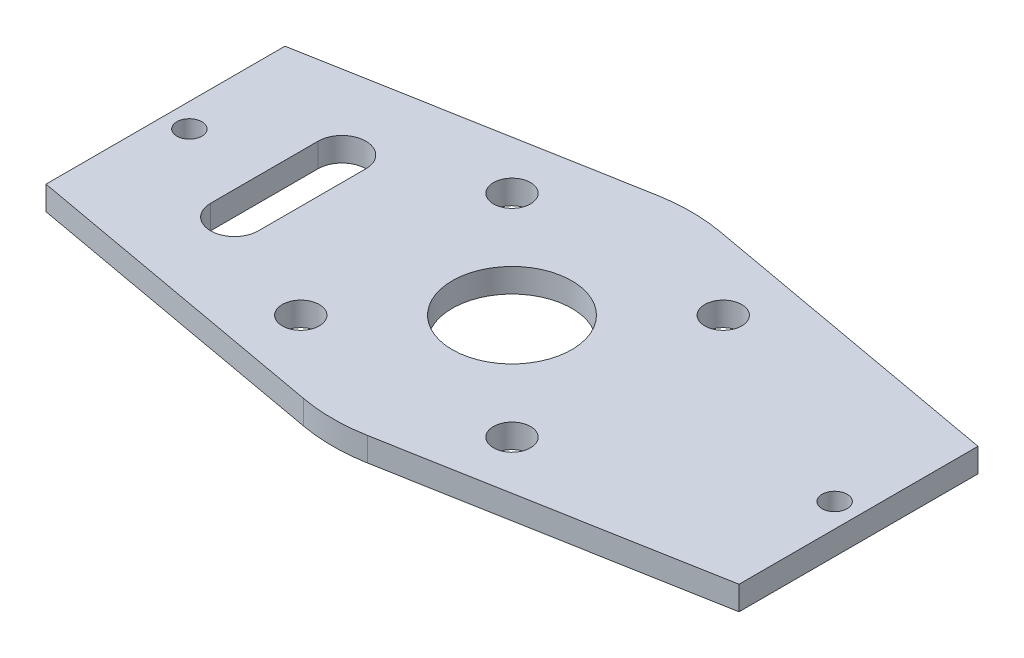
ISO-10303-21;
HEADER;
FILE_DESCRIPTION(('STEP AP214'),'2;1');
FILE_NAME('part.step','',(''),(''),'','','');
FILE_SCHEMA(('AUTOMOTIVE_DESIGN { 1 0 10303 214 1 1 1 1 }'));
ENDSEC;
DATA;
#1=APPLICATION_CONTEXT('core data for automotive mechanical design processes');
#2=APPLICATION_PROTOCOL_DEFINITION('international standard','automotive_design',2000,#1);
#3=PRODUCT_CONTEXT('',#1,'mechanical');
#4=PRODUCT('Part','Part','',(#3));
#5=PRODUCT_RELATED_PRODUCT_CATEGORY('part','',(#4));
#6=PRODUCT_DEFINITION_FORMATION('','',#4);
#7=PRODUCT_DEFINITION_CONTEXT('part definition',#1,'design');
#8=PRODUCT_DEFINITION('design','',#6,#7);
#9=PRODUCT_DEFINITION_SHAPE('','',#8);
#10=(LENGTH_UNIT() NAMED_UNIT(*) SI_UNIT(.MILLI.,.METRE.));
#11=(NAMED_UNIT(*) PLANE_ANGLE_UNIT() SI_UNIT($,.RADIAN.));
#12=(NAMED_UNIT(*) SI_UNIT($,.STERADIAN.) SOLID_ANGLE_UNIT());
#13=UNCERTAINTY_MEASURE_WITH_UNIT(LENGTH_MEASURE(1.E-05),#10,'distance_accuracy_value','');
#14=(GEOMETRIC_REPRESENTATION_CONTEXT(3) GLOBAL_UNCERTAINTY_ASSIGNED_CONTEXT((#13)) GLOBAL_UNIT_ASSIGNED_CONTEXT((#10,
#11,#12)) REPRESENTATION_CONTEXT('',''));
#15=CARTESIAN_POINT('',(0.,0.,0.));
#16=DIRECTION('',(0.,0.,1.));
#17=DIRECTION('',(1.,0.,0.));
#18=AXIS2_PLACEMENT_3D('',#15,#16,#17);
#19=CARTESIAN_POINT('',(0.,2.,0.));
#20=DIRECTION('',(0.,-1.,0.));
#21=DIRECTION('',(0.,0.,-1.));
#22=AXIS2_PLACEMENT_3D('',#19,#20,#21);
#23=PLANE('',#22);
#24=CARTESIAN_POINT('',(-27.,2.,0.));
#25=DIRECTION('',(0.,1.,0.));
#26=DIRECTION('',(0.,0.,1.));
#27=AXIS2_PLACEMENT_3D('',#24,#25,#26);
#28=CIRCLE('',#27,1.05);
#29=CARTESIAN_POINT('',(-27.,2.,1.05));
#30=VERTEX_POINT('',#29);
#31=EDGE_CURVE('E163',#30,#30,#28,.T.);
#32=ORIENTED_EDGE('',*,*,#31,.F.);
#33=EDGE_LOOP('',(#32));
#34=FACE_BOUND('',#33,.T.);
#35=CARTESIAN_POINT('',(27.,2.,0.));
#36=DIRECTION('',(0.,1.,0.));
#37=DIRECTION('',(0.,0.,1.));
#38=AXIS2_PLACEMENT_3D('',#35,#36,#37);
#39=CIRCLE('',#38,1.05);
#40=CARTESIAN_POINT('',(27.,2.,1.05));
#41=VERTEX_POINT('',#40);
#42=EDGE_CURVE('E169',#41,#41,#39,.T.);
#43=ORIENTED_EDGE('',*,*,#42,.F.);
#44=EDGE_LOOP('',(#43));
#45=FACE_BOUND('',#44,.T.);
#46=CARTESIAN_POINT('',(8.83883476483235,2.,8.83883476483183));
#47=DIRECTION('',(0.,1.,0.));
#48=DIRECTION('',(0.,0.,1.));
#49=AXIS2_PLACEMENT_3D('',#46,#47,#48);
#50=CIRCLE('',#49,1.54999999999988);
#51=CARTESIAN_POINT('',(8.83883476483235,2.,10.3888347648317));
#52=VERTEX_POINT('',#51);
#53=EDGE_CURVE('E175',#52,#52,#50,.T.);
#54=ORIENTED_EDGE('',*,*,#53,.F.);
#55=EDGE_LOOP('',(#54));
#56=FACE_BOUND('',#55,.T.);
#57=CARTESIAN_POINT('',(8.83883476483183,2.,-8.83883476483186));
#58=DIRECTION('',(0.,1.,0.));
#59=DIRECTION('',(0.,0.,1.));
#60=AXIS2_PLACEMENT_3D('',#57,#58,#59);
#61=CIRCLE('',#60,1.55);
#62=CARTESIAN_POINT('',(8.83883476483183,2.,-7.28883476483186));
#63=VERTEX_POINT('',#62);
#64=EDGE_CURVE('E181',#63,#63,#61,.T.);
#65=ORIENTED_EDGE('',*,*,#64,.F.);
#66=EDGE_LOOP('',(#65));
#67=FACE_BOUND('',#66,.T.);
#68=CARTESIAN_POINT('',(0.,2.,0.));
#69=DIRECTION('',(0.,1.,0.));
#70=DIRECTION('',(0.,0.,1.));
#71=AXIS2_PLACEMENT_3D('',#68,#69,#70);
#72=CIRCLE('',#71,5.);
#73=CARTESIAN_POINT('',(0.,2.,5.));
#74=VERTEX_POINT('',#73);
#75=EDGE_CURVE('E187',#74,#74,#72,.T.);
#76=ORIENTED_EDGE('',*,*,#75,.F.);
#77=EDGE_LOOP('',(#76));
#78=FACE_BOUND('',#77,.T.);
#79=CARTESIAN_POINT('',(0.,2.,0.));
#80=DIRECTION('',(0.,1.,0.));
#81=DIRECTION('',(0.,0.,-1.));
#82=AXIS2_PLACEMENT_3D('',#79,#80,#81);
#83=CIRCLE('',#82,15.);
#84=CARTESIAN_POINT('',(2.66872853551764,2.,-14.7606872469988));
#85=VERTEX_POINT('',#84);
#86=CARTESIAN_POINT('',(-2.66872853551764,2.,-14.7606872469988));
#87=VERTEX_POINT('',#86);
#88=EDGE_CURVE('E193',#85,#87,#83,.T.);
#89=ORIENTED_EDGE('',*,*,#88,.T.);
#90=DIRECTION('',(-0.984045816466589,0.,0.177915235701176));
#91=VECTOR('',#90,1.);
#92=CARTESIAN_POINT('',(-2.66872853551764,2.,-14.7606872469988));
#93=LINE('',#92,#91);
#94=CARTESIAN_POINT('',(-29.,2.,-10.));
#95=VERTEX_POINT('',#94);
#96=EDGE_CURVE('E196',#87,#95,#93,.T.);
#97=ORIENTED_EDGE('',*,*,#96,.T.);
#98=DIRECTION('',(0.,0.,1.));
#99=VECTOR('',#98,1.);
#100=CARTESIAN_POINT('',(-29.,2.,-10.));
#101=LINE('',#100,#99);
#102=CARTESIAN_POINT('',(-29.,2.,9.99999999999999));
#103=VERTEX_POINT('',#102);
#104=EDGE_CURVE('E199',#95,#103,#101,.T.);
#105=ORIENTED_EDGE('',*,*,#104,.T.);
#106=DIRECTION('',(0.984045816466589,0.,0.177915235701176));
#107=VECTOR('',#106,1.);
#108=CARTESIAN_POINT('',(-2.66872853551765,2.,14.7606872469988));
#109=LINE('',#108,#107);
#110=CARTESIAN_POINT('',(-2.66872853551764,2.,14.7606872469988));
#111=VERTEX_POINT('',#110);
#112=EDGE_CURVE('E201',#103,#111,#109,.T.);
#113=ORIENTED_EDGE('',*,*,#112,.T.);
#114=CARTESIAN_POINT('',(0.,2.,0.));
#115=DIRECTION('',(0.,1.,0.));
#116=DIRECTION('',(0.,0.,-1.));
#117=AXIS2_PLACEMENT_3D('',#114,#115,#116);
#118=CIRCLE('',#117,15.);
#119=CARTESIAN_POINT('',(2.66872853551765,2.,14.7606872469988));
#120=VERTEX_POINT('',#119);
#121=EDGE_CURVE('E203',#111,#120,#118,.T.);
#122=ORIENTED_EDGE('',*,*,#121,.T.);
#123=DIRECTION('',(0.984045816466589,0.,-0.177915235701177));
#124=VECTOR('',#123,1.);
#125=CARTESIAN_POINT('',(2.66872853551765,2.,14.7606872469988));
#126=LINE('',#125,#124);
#127=CARTESIAN_POINT('',(29.,2.,9.99999999999999));
#128=VERTEX_POINT('',#127);
#129=EDGE_CURVE('E205',#120,#128,#126,.T.);
#130=ORIENTED_EDGE('',*,*,#129,.T.);
#131=DIRECTION('',(0.,0.,-1.));
#132=VECTOR('',#131,1.);
#133=CARTESIAN_POINT('',(29.,2.,-10.));
#134=LINE('',#133,#132);
#135=CARTESIAN_POINT('',(29.,2.,-10.));
#136=VERTEX_POINT('',#135);
#137=EDGE_CURVE('E207',#128,#136,#134,.T.);
#138=ORIENTED_EDGE('',*,*,#137,.T.);
#139=DIRECTION('',(-0.984045816466589,0.,-0.177915235701176));
#140=VECTOR('',#139,1.);
#141=CARTESIAN_POINT('',(2.66872853551764,2.,-14.7606872469988));
#142=LINE('',#141,#140);
#143=EDGE_CURVE('E209',#136,#85,#142,.T.);
#144=ORIENTED_EDGE('',*,*,#143,.T.);
#145=EDGE_LOOP('',(#89,#97,#105,#113,#122,#130,#138,#144));
#146=FACE_BOUND('',#145,.T.);
#147=CARTESIAN_POINT('',(-18.7281406355338,2.,4.5));
#148=DIRECTION('',(0.,1.,0.));
#149=DIRECTION('',(0.,0.,1.));
#150=AXIS2_PLACEMENT_3D('',#147,#148,#149);
#151=CIRCLE('',#150,2.);
#152=CARTESIAN_POINT('',(-20.7281406355338,2.,4.5));
#153=VERTEX_POINT('',#152);
#154=CARTESIAN_POINT('',(-16.7281406355338,2.,4.5));
#155=VERTEX_POINT('',#154);
#156=EDGE_CURVE('E124',#153,#155,#151,.T.);
#157=ORIENTED_EDGE('',*,*,#156,.F.);
#158=DIRECTION('',(0.,0.,1.));
#159=VECTOR('',#158,1.);
#160=CARTESIAN_POINT('',(-20.7281406355338,2.,4.5));
#161=LINE('',#160,#159);
#162=CARTESIAN_POINT('',(-20.7281406355338,2.,-4.5));
#163=VERTEX_POINT('',#162);
#164=EDGE_CURVE('E147',#163,#153,#161,.T.);
#165=ORIENTED_EDGE('',*,*,#164,.F.);
#166=CARTESIAN_POINT('',(-18.7281406355338,2.,-4.5));
#167=DIRECTION('',(0.,1.,0.));
#168=DIRECTION('',(0.,0.,1.));
#169=AXIS2_PLACEMENT_3D('',#166,#167,#168);
#170=CIRCLE('',#169,2.);
#171=CARTESIAN_POINT('',(-16.7281406355338,2.,-4.5));
#172=VERTEX_POINT('',#171);
#173=EDGE_CURVE('E145',#172,#163,#170,.T.);
#174=ORIENTED_EDGE('',*,*,#173,.F.);
#175=DIRECTION('',(0.,0.,-1.));
#176=VECTOR('',#175,1.);
#177=CARTESIAN_POINT('',(-16.7281406355338,2.,4.5));
#178=LINE('',#177,#176);
#179=EDGE_CURVE('E132',#155,#172,#178,.T.);
#180=ORIENTED_EDGE('',*,*,#179,.F.);
#181=EDGE_LOOP('',(#157,#165,#174,#180));
#182=FACE_BOUND('',#181,.T.);
#183=CARTESIAN_POINT('',(-8.83883476483135,2.,8.83883476483234));
#184=DIRECTION('',(0.,1.,0.));
#185=DIRECTION('',(0.,0.,1.));
#186=AXIS2_PLACEMENT_3D('',#183,#184,#185);
#187=CIRCLE('',#186,1.55000000000036);
#188=CARTESIAN_POINT('',(-8.83883476483135,2.,10.3888347648327));
#189=VERTEX_POINT('',#188);
#190=EDGE_CURVE('E153',#189,#189,#187,.T.);
#191=ORIENTED_EDGE('',*,*,#190,.F.);
#192=EDGE_LOOP('',(#191));
#193=FACE_BOUND('',#192,.T.);
#194=CARTESIAN_POINT('',(-8.83883476483186,2.,-8.83883476483133));
#195=DIRECTION('',(0.,1.,0.));
#196=DIRECTION('',(0.,0.,1.));
#197=AXIS2_PLACEMENT_3D('',#194,#195,#196);
#198=CIRCLE('',#197,1.55000000000054);
#199=CARTESIAN_POINT('',(-8.83883476483186,2.,-7.2888347648308));
#200=VERTEX_POINT('',#199);
#201=EDGE_CURVE('E331',#200,#200,#198,.T.);
#202=ORIENTED_EDGE('',*,*,#201,.F.);
#203=EDGE_LOOP('',(#202));
#204=FACE_BOUND('',#203,.T.);
#205=ADVANCED_FACE('F35',(#34,#45,#56,#67,#78,#146,#182,#193,#204),#23,.F.);
#206=CARTESIAN_POINT('',(0.,0.,0.));
#207=DIRECTION('',(0.,-1.,0.));
#208=DIRECTION('',(0.,0.,-1.));
#209=AXIS2_PLACEMENT_3D('',#206,#207,#208);
#210=PLANE('',#209);
#211=CARTESIAN_POINT('',(-8.83883476483135,0.,8.83883476483234));
#212=DIRECTION('',(0.,1.,0.));
#213=DIRECTION('',(0.,0.,1.));
#214=AXIS2_PLACEMENT_3D('',#211,#212,#213);
#215=CIRCLE('',#214,1.55000000000036);
#216=CARTESIAN_POINT('',(-8.83883476483135,0.,10.3888347648327));
#217=VERTEX_POINT('',#216);
#218=EDGE_CURVE('E334',#217,#217,#215,.T.);
#219=ORIENTED_EDGE('',*,*,#218,.T.);
#220=EDGE_LOOP('',(#219));
#221=FACE_BOUND('',#220,.T.);
#222=CARTESIAN_POINT('',(27.,0.,0.));
#223=DIRECTION('',(0.,1.,0.));
#224=DIRECTION('',(0.,0.,1.));
#225=AXIS2_PLACEMENT_3D('',#222,#223,#224);
#226=CIRCLE('',#225,1.05);
#227=CARTESIAN_POINT('',(27.,0.,1.05));
#228=VERTEX_POINT('',#227);
#229=EDGE_CURVE('E166',#228,#228,#226,.T.);
#230=ORIENTED_EDGE('',*,*,#229,.T.);
#231=EDGE_LOOP('',(#230));
#232=FACE_BOUND('',#231,.T.);
#233=CARTESIAN_POINT('',(8.83883476483183,0.,-8.83883476483186));
#234=DIRECTION('',(0.,1.,0.));
#235=DIRECTION('',(0.,0.,1.));
#236=AXIS2_PLACEMENT_3D('',#233,#234,#235);
#237=CIRCLE('',#236,1.55);
#238=CARTESIAN_POINT('',(8.83883476483183,0.,-7.28883476483186));
#239=VERTEX_POINT('',#238);
#240=EDGE_CURVE('E178',#239,#239,#237,.T.);
#241=ORIENTED_EDGE('',*,*,#240,.T.);
#242=EDGE_LOOP('',(#241));
#243=FACE_BOUND('',#242,.T.);
#244=CARTESIAN_POINT('',(0.,0.,0.));
#245=DIRECTION('',(0.,1.,0.));
#246=DIRECTION('',(0.,0.,-1.));
#247=AXIS2_PLACEMENT_3D('',#244,#245,#246);
#248=CIRCLE('',#247,15.);
#249=CARTESIAN_POINT('',(2.66872853551764,0.,-14.7606872469988));
#250=VERTEX_POINT('',#249);
#251=CARTESIAN_POINT('',(-2.66872853551764,0.,-14.7606872469988));
#252=VERTEX_POINT('',#251);
#253=EDGE_CURVE('E190',#250,#252,#248,.T.);
#254=ORIENTED_EDGE('',*,*,#253,.F.);
#255=DIRECTION('',(-0.984045816466589,0.,-0.177915235701176));
#256=VECTOR('',#255,1.);
#257=CARTESIAN_POINT('',(2.66872853551764,0.,-14.7606872469988));
#258=LINE('',#257,#256);
#259=CARTESIAN_POINT('',(29.,0.,-10.));
#260=VERTEX_POINT('',#259);
#261=EDGE_CURVE('E197',#260,#250,#258,.T.);
#262=ORIENTED_EDGE('',*,*,#261,.F.);
#263=DIRECTION('',(0.,0.,-1.));
#264=VECTOR('',#263,1.);
#265=CARTESIAN_POINT('',(29.,0.,-10.));
#266=LINE('',#265,#264);
#267=CARTESIAN_POINT('',(29.,0.,9.99999999999999));
#268=VERTEX_POINT('',#267);
#269=EDGE_CURVE('E224',#268,#260,#266,.T.);
#270=ORIENTED_EDGE('',*,*,#269,.F.);
#271=DIRECTION('',(0.984045816466589,0.,-0.177915235701177));
#272=VECTOR('',#271,1.);
#273=CARTESIAN_POINT('',(2.66872853551765,0.,14.7606872469988));
#274=LINE('',#273,#272);
#275=CARTESIAN_POINT('',(2.66872853551765,0.,14.7606872469988));
#276=VERTEX_POINT('',#275);
#277=EDGE_CURVE('E222',#276,#268,#274,.T.);
#278=ORIENTED_EDGE('',*,*,#277,.F.);
#279=CARTESIAN_POINT('',(0.,0.,0.));
#280=DIRECTION('',(0.,1.,0.));
#281=DIRECTION('',(0.,0.,-1.));
#282=AXIS2_PLACEMENT_3D('',#279,#280,#281);
#283=CIRCLE('',#282,15.);
#284=CARTESIAN_POINT('',(-2.66872853551764,0.,14.7606872469988));
#285=VERTEX_POINT('',#284);
#286=EDGE_CURVE('E220',#285,#276,#283,.T.);
#287=ORIENTED_EDGE('',*,*,#286,.F.);
#288=DIRECTION('',(0.984045816466589,0.,0.177915235701176));
#289=VECTOR('',#288,1.);
#290=CARTESIAN_POINT('',(-2.66872853551765,0.,14.7606872469988));
#291=LINE('',#290,#289);
#292=CARTESIAN_POINT('',(-29.,0.,9.99999999999999));
#293=VERTEX_POINT('',#292);
#294=EDGE_CURVE('E218',#293,#285,#291,.T.);
#295=ORIENTED_EDGE('',*,*,#294,.F.);
#296=DIRECTION('',(0.,0.,1.));
#297=VECTOR('',#296,1.);
#298=CARTESIAN_POINT('',(-29.,0.,-10.));
#299=LINE('',#298,#297);
#300=CARTESIAN_POINT('',(-29.,0.,-10.));
#301=VERTEX_POINT('',#300);
#302=EDGE_CURVE('E216',#301,#293,#299,.T.);
#303=ORIENTED_EDGE('',*,*,#302,.F.);
#304=DIRECTION('',(-0.984045816466589,0.,0.177915235701176));
#305=VECTOR('',#304,1.);
#306=CARTESIAN_POINT('',(-2.66872853551764,0.,-14.7606872469988));
#307=LINE('',#306,#305);
#308=EDGE_CURVE('E214',#252,#301,#307,.T.);
#309=ORIENTED_EDGE('',*,*,#308,.F.);
#310=EDGE_LOOP('',(#254,#262,#270,#278,#287,#295,#303,#309));
#311=FACE_BOUND('',#310,.T.);
#312=CARTESIAN_POINT('',(0.,0.,0.));
#313=DIRECTION('',(0.,1.,0.));
#314=DIRECTION('',(0.,0.,1.));
#315=AXIS2_PLACEMENT_3D('',#312,#313,#314);
#316=CIRCLE('',#315,5.);
#317=CARTESIAN_POINT('',(0.,0.,5.));
#318=VERTEX_POINT('',#317);
#319=EDGE_CURVE('E184',#318,#318,#316,.T.);
#320=ORIENTED_EDGE('',*,*,#319,.T.);
#321=EDGE_LOOP('',(#320));
#322=FACE_BOUND('',#321,.T.);
#323=CARTESIAN_POINT('',(8.83883476483235,0.,8.83883476483183));
#324=DIRECTION('',(0.,1.,0.));
#325=DIRECTION('',(0.,0.,1.));
#326=AXIS2_PLACEMENT_3D('',#323,#324,#325);
#327=CIRCLE('',#326,1.54999999999988);
#328=CARTESIAN_POINT('',(8.83883476483235,0.,10.3888347648317));
#329=VERTEX_POINT('',#328);
#330=EDGE_CURVE('E172',#329,#329,#327,.T.);
#331=ORIENTED_EDGE('',*,*,#330,.T.);
#332=EDGE_LOOP('',(#331));
#333=FACE_BOUND('',#332,.T.);
#334=CARTESIAN_POINT('',(-27.,0.,0.));
#335=DIRECTION('',(0.,1.,0.));
#336=DIRECTION('',(0.,0.,1.));
#337=AXIS2_PLACEMENT_3D('',#334,#335,#336);
#338=CIRCLE('',#337,1.05);
#339=CARTESIAN_POINT('',(-27.,0.,1.05));
#340=VERTEX_POINT('',#339);
#341=EDGE_CURVE('E140',#340,#340,#338,.T.);
#342=ORIENTED_EDGE('',*,*,#341,.T.);
#343=EDGE_LOOP('',(#342));
#344=FACE_BOUND('',#343,.T.);
#345=DIRECTION('',(0.,0.,1.));
#346=VECTOR('',#345,1.);
#347=CARTESIAN_POINT('',(-20.7281406355338,0.,4.5));
#348=LINE('',#347,#346);
#349=CARTESIAN_POINT('',(-20.7281406355338,0.,-4.5));
#350=VERTEX_POINT('',#349);
#351=CARTESIAN_POINT('',(-20.7281406355338,0.,4.5));
#352=VERTEX_POINT('',#351);
#353=EDGE_CURVE('E133',#350,#352,#348,.T.);
#354=ORIENTED_EDGE('',*,*,#353,.T.);
#355=CARTESIAN_POINT('',(-18.7281406355338,0.,4.5));
#356=DIRECTION('',(0.,1.,0.));
#357=DIRECTION('',(0.,0.,1.));
#358=AXIS2_PLACEMENT_3D('',#355,#356,#357);
#359=CIRCLE('',#358,2.);
#360=CARTESIAN_POINT('',(-16.7281406355338,0.,4.5));
#361=VERTEX_POINT('',#360);
#362=EDGE_CURVE('E58',#352,#361,#359,.T.);
#363=ORIENTED_EDGE('',*,*,#362,.T.);
#364=DIRECTION('',(0.,0.,-1.));
#365=VECTOR('',#364,1.);
#366=CARTESIAN_POINT('',(-16.7281406355338,0.,4.5));
#367=LINE('',#366,#365);
#368=CARTESIAN_POINT('',(-16.7281406355338,0.,-4.5));
#369=VERTEX_POINT('',#368);
#370=EDGE_CURVE('E139',#361,#369,#367,.T.);
#371=ORIENTED_EDGE('',*,*,#370,.T.);
#372=CARTESIAN_POINT('',(-18.7281406355338,0.,-4.5));
#373=DIRECTION('',(0.,1.,0.));
#374=DIRECTION('',(0.,0.,1.));
#375=AXIS2_PLACEMENT_3D('',#372,#373,#374);
#376=CIRCLE('',#375,2.);
#377=EDGE_CURVE('E155',#369,#350,#376,.T.);
#378=ORIENTED_EDGE('',*,*,#377,.T.);
#379=EDGE_LOOP('',(#354,#363,#371,#378));
#380=FACE_BOUND('',#379,.T.);
#381=CARTESIAN_POINT('',(-8.83883476483186,0.,-8.83883476483133));
#382=DIRECTION('',(0.,1.,0.));
#383=DIRECTION('',(0.,0.,1.));
#384=AXIS2_PLACEMENT_3D('',#381,#382,#383);
#385=CIRCLE('',#384,1.55000000000054);
#386=CARTESIAN_POINT('',(-8.83883476483186,0.,-7.2888347648308));
#387=VERTEX_POINT('',#386);
#388=EDGE_CURVE('E329',#387,#387,#385,.T.);
#389=ORIENTED_EDGE('',*,*,#388,.T.);
#390=EDGE_LOOP('',(#389));
#391=FACE_BOUND('',#390,.T.);
#392=ADVANCED_FACE('F254',(#221,#232,#243,#311,#322,#333,#344,#380,#391),#210,.T.);
#393=CARTESIAN_POINT('',(0.,2.,0.));
#394=DIRECTION('',(0.,-1.,0.));
#395=DIRECTION('',(0.,0.,-1.));
#396=AXIS2_PLACEMENT_3D('',#393,#394,#395);
#397=CYLINDRICAL_SURFACE('',#396,15.);
#398=ORIENTED_EDGE('',*,*,#253,.T.);
#399=DIRECTION('',(0.,-1.,0.));
#400=VECTOR('',#399,1.);
#401=CARTESIAN_POINT('',(-2.66872853551764,2.,-14.7606872469988));
#402=LINE('',#401,#400);
#403=EDGE_CURVE('E11',#87,#252,#402,.T.);
#404=ORIENTED_EDGE('',*,*,#403,.F.);
#405=ORIENTED_EDGE('',*,*,#88,.F.);
#406=DIRECTION('',(0.,-1.,0.));
#407=VECTOR('',#406,1.);
#408=CARTESIAN_POINT('',(2.66872853551764,2.,-14.7606872469988));
#409=LINE('',#408,#407);
#410=EDGE_CURVE('E211',#85,#250,#409,.T.);
#411=ORIENTED_EDGE('',*,*,#410,.T.);
#412=EDGE_LOOP('',(#398,#404,#405,#411));
#413=FACE_BOUND('',#412,.T.);
#414=ADVANCED_FACE('F37',(#413),#397,.T.);
#415=CARTESIAN_POINT('',(-2.66872853551764,2.,-14.7606872469988));
#416=DIRECTION('',(0.177915235701176,0.,0.984045816466589));
#417=DIRECTION('',(0.984045816466589,0.,-0.177915235701176));
#418=AXIS2_PLACEMENT_3D('',#415,#416,#417);
#419=PLANE('',#418);
#420=ORIENTED_EDGE('',*,*,#308,.T.);
#421=DIRECTION('',(0.,-1.,0.));
#422=VECTOR('',#421,1.);
#423=CARTESIAN_POINT('',(-29.,2.,-10.));
#424=LINE('',#423,#422);
#425=EDGE_CURVE('E43',#95,#301,#424,.T.);
#426=ORIENTED_EDGE('',*,*,#425,.F.);
#427=ORIENTED_EDGE('',*,*,#96,.F.);
#428=ORIENTED_EDGE('',*,*,#403,.T.);
#429=EDGE_LOOP('',(#420,#426,#427,#428));
#430=FACE_BOUND('',#429,.T.);
#431=ADVANCED_FACE('F271',(#430),#419,.F.);
#432=CARTESIAN_POINT('',(-29.,2.,-10.));
#433=DIRECTION('',(1.,0.,0.));
#434=DIRECTION('',(0.,0.,-1.));
#435=AXIS2_PLACEMENT_3D('',#432,#433,#434);
#436=PLANE('',#435);
#437=ORIENTED_EDGE('',*,*,#302,.T.);
#438=DIRECTION('',(0.,-1.,0.));
#439=VECTOR('',#438,1.);
#440=CARTESIAN_POINT('',(-29.,2.,9.99999999999999));
#441=LINE('',#440,#439);
#442=EDGE_CURVE('E241',#103,#293,#441,.T.);
#443=ORIENTED_EDGE('',*,*,#442,.F.);
#444=ORIENTED_EDGE('',*,*,#104,.F.);
#445=ORIENTED_EDGE('',*,*,#425,.T.);
#446=EDGE_LOOP('',(#437,#443,#444,#445));
#447=FACE_BOUND('',#446,.T.);
#448=ADVANCED_FACE('F248',(#447),#436,.F.);
#449=CARTESIAN_POINT('',(-2.66872853551765,2.,14.7606872469988));
#450=DIRECTION('',(0.177915235701176,0.,-0.984045816466589));
#451=DIRECTION('',(-0.984045816466589,0.,-0.177915235701176));
#452=AXIS2_PLACEMENT_3D('',#449,#450,#451);
#453=PLANE('',#452);
#454=ORIENTED_EDGE('',*,*,#294,.T.);
#455=DIRECTION('',(0.,-1.,0.));
#456=VECTOR('',#455,1.);
#457=CARTESIAN_POINT('',(-2.66872853551764,2.,14.7606872469988));
#458=LINE('',#457,#456);
#459=EDGE_CURVE('E238',#111,#285,#458,.T.);
#460=ORIENTED_EDGE('',*,*,#459,.F.);
#461=ORIENTED_EDGE('',*,*,#112,.F.);
#462=ORIENTED_EDGE('',*,*,#442,.T.);
#463=EDGE_LOOP('',(#454,#460,#461,#462));
#464=FACE_BOUND('',#463,.T.);
#465=ADVANCED_FACE('F260',(#464),#453,.F.);
#466=CARTESIAN_POINT('',(0.,2.,0.));
#467=DIRECTION('',(0.,-1.,0.));
#468=DIRECTION('',(0.,0.,-1.));
#469=AXIS2_PLACEMENT_3D('',#466,#467,#468);
#470=CYLINDRICAL_SURFACE('',#469,15.);
#471=ORIENTED_EDGE('',*,*,#286,.T.);
#472=DIRECTION('',(0.,-1.,0.));
#473=VECTOR('',#472,1.);
#474=CARTESIAN_POINT('',(2.66872853551765,2.,14.7606872469988));
#475=LINE('',#474,#473);
#476=EDGE_CURVE('E235',#120,#276,#475,.T.);
#477=ORIENTED_EDGE('',*,*,#476,.F.);
#478=ORIENTED_EDGE('',*,*,#121,.F.);
#479=ORIENTED_EDGE('',*,*,#459,.T.);
#480=EDGE_LOOP('',(#471,#477,#478,#479));
#481=FACE_BOUND('',#480,.T.);
#482=ADVANCED_FACE('F264',(#481),#470,.T.);
#483=CARTESIAN_POINT('',(2.66872853551765,2.,14.7606872469988));
#484=DIRECTION('',(-0.177915235701177,0.,-0.984045816466589));
#485=DIRECTION('',(-0.984045816466589,0.,0.177915235701177));
#486=AXIS2_PLACEMENT_3D('',#483,#484,#485);
#487=PLANE('',#486);
#488=ORIENTED_EDGE('',*,*,#277,.T.);
#489=DIRECTION('',(0.,-1.,0.));
#490=VECTOR('',#489,1.);
#491=CARTESIAN_POINT('',(29.,2.,9.99999999999999));
#492=LINE('',#491,#490);
#493=EDGE_CURVE('E232',#128,#268,#492,.T.);
#494=ORIENTED_EDGE('',*,*,#493,.F.);
#495=ORIENTED_EDGE('',*,*,#129,.F.);
#496=ORIENTED_EDGE('',*,*,#476,.T.);
#497=EDGE_LOOP('',(#488,#494,#495,#496));
#498=FACE_BOUND('',#497,.T.);
#499=ADVANCED_FACE('F284',(#498),#487,.F.);
#500=CARTESIAN_POINT('',(29.,2.,-10.));
#501=DIRECTION('',(-1.,0.,0.));
#502=DIRECTION('',(0.,0.,1.));
#503=AXIS2_PLACEMENT_3D('',#500,#501,#502);
#504=PLANE('',#503);
#505=ORIENTED_EDGE('',*,*,#269,.T.);
#506=DIRECTION('',(0.,-1.,0.));
#507=VECTOR('',#506,1.);
#508=CARTESIAN_POINT('',(29.,2.,-10.));
#509=LINE('',#508,#507);
#510=EDGE_CURVE('E229',#136,#260,#509,.T.);
#511=ORIENTED_EDGE('',*,*,#510,.F.);
#512=ORIENTED_EDGE('',*,*,#137,.F.);
#513=ORIENTED_EDGE('',*,*,#493,.T.);
#514=EDGE_LOOP('',(#505,#511,#512,#513));
#515=FACE_BOUND('',#514,.T.);
#516=ADVANCED_FACE('F282',(#515),#504,.F.);
#517=CARTESIAN_POINT('',(2.66872853551764,2.,-14.7606872469988));
#518=DIRECTION('',(-0.177915235701176,0.,0.984045816466589));
#519=DIRECTION('',(0.984045816466589,0.,0.177915235701176));
#520=AXIS2_PLACEMENT_3D('',#517,#518,#519);
#521=PLANE('',#520);
#522=ORIENTED_EDGE('',*,*,#261,.T.);
#523=ORIENTED_EDGE('',*,*,#410,.F.);
#524=ORIENTED_EDGE('',*,*,#143,.F.);
#525=ORIENTED_EDGE('',*,*,#510,.T.);
#526=EDGE_LOOP('',(#522,#523,#524,#525));
#527=FACE_BOUND('',#526,.T.);
#528=ADVANCED_FACE('F277',(#527),#521,.F.);
#529=CARTESIAN_POINT('',(0.,2.,0.));
#530=DIRECTION('',(0.,-1.,0.));
#531=DIRECTION('',(0.,0.,-1.));
#532=AXIS2_PLACEMENT_3D('',#529,#530,#531);
#533=CYLINDRICAL_SURFACE('',#532,5.);
#534=ORIENTED_EDGE('',*,*,#75,.T.);
#535=EDGE_LOOP('',(#534));
#536=FACE_BOUND('',#535,.T.);
#537=ORIENTED_EDGE('',*,*,#319,.F.);
#538=EDGE_LOOP('',(#537));
#539=FACE_BOUND('',#538,.T.);
#540=ADVANCED_FACE('F304',(#536,#539),#533,.F.);
#541=CARTESIAN_POINT('',(8.83883476483183,2.,-8.83883476483186));
#542=DIRECTION('',(0.,-1.,0.));
#543=DIRECTION('',(0.,0.,-1.));
#544=AXIS2_PLACEMENT_3D('',#541,#542,#543);
#545=CYLINDRICAL_SURFACE('',#544,1.55);
#546=ORIENTED_EDGE('',*,*,#64,.T.);
#547=EDGE_LOOP('',(#546));
#548=FACE_BOUND('',#547,.T.);
#549=ORIENTED_EDGE('',*,*,#240,.F.);
#550=EDGE_LOOP('',(#549));
#551=FACE_BOUND('',#550,.T.);
#552=ADVANCED_FACE('F311',(#548,#551),#545,.F.);
#553=CARTESIAN_POINT('',(8.83883476483235,2.,8.83883476483183));
#554=DIRECTION('',(0.,-1.,0.));
#555=DIRECTION('',(0.,0.,-1.));
#556=AXIS2_PLACEMENT_3D('',#553,#554,#555);
#557=CYLINDRICAL_SURFACE('',#556,1.54999999999988);
#558=ORIENTED_EDGE('',*,*,#53,.T.);
#559=EDGE_LOOP('',(#558));
#560=FACE_BOUND('',#559,.T.);
#561=ORIENTED_EDGE('',*,*,#330,.F.);
#562=EDGE_LOOP('',(#561));
#563=FACE_BOUND('',#562,.T.);
#564=ADVANCED_FACE('F316',(#560,#563),#557,.F.);
#565=CARTESIAN_POINT('',(27.,2.,0.));
#566=DIRECTION('',(0.,-1.,0.));
#567=DIRECTION('',(0.,0.,-1.));
#568=AXIS2_PLACEMENT_3D('',#565,#566,#567);
#569=CYLINDRICAL_SURFACE('',#568,1.05);
#570=ORIENTED_EDGE('',*,*,#42,.T.);
#571=EDGE_LOOP('',(#570));
#572=FACE_BOUND('',#571,.T.);
#573=ORIENTED_EDGE('',*,*,#229,.F.);
#574=EDGE_LOOP('',(#573));
#575=FACE_BOUND('',#574,.T.);
#576=ADVANCED_FACE('F367',(#572,#575),#569,.F.);
#577=CARTESIAN_POINT('',(-27.,2.,0.));
#578=DIRECTION('',(0.,-1.,0.));
#579=DIRECTION('',(0.,0.,-1.));
#580=AXIS2_PLACEMENT_3D('',#577,#578,#579);
#581=CYLINDRICAL_SURFACE('',#580,1.05);
#582=ORIENTED_EDGE('',*,*,#31,.T.);
#583=EDGE_LOOP('',(#582));
#584=FACE_BOUND('',#583,.T.);
#585=ORIENTED_EDGE('',*,*,#341,.F.);
#586=EDGE_LOOP('',(#585));
#587=FACE_BOUND('',#586,.T.);
#588=ADVANCED_FACE('F364',(#584,#587),#581,.F.);
#589=CARTESIAN_POINT('',(-18.7281406355338,2.,4.5));
#590=DIRECTION('',(0.,-1.,0.));
#591=DIRECTION('',(0.,0.,-1.));
#592=AXIS2_PLACEMENT_3D('',#589,#590,#591);
#593=CYLINDRICAL_SURFACE('',#592,2.);
#594=ORIENTED_EDGE('',*,*,#362,.F.);
#595=DIRECTION('',(0.,-1.,0.));
#596=VECTOR('',#595,1.);
#597=CARTESIAN_POINT('',(-20.7281406355338,2.,4.5));
#598=LINE('',#597,#596);
#599=EDGE_CURVE('E128',#153,#352,#598,.T.);
#600=ORIENTED_EDGE('',*,*,#599,.F.);
#601=ORIENTED_EDGE('',*,*,#156,.T.);
#602=DIRECTION('',(0.,-1.,0.));
#603=VECTOR('',#602,1.);
#604=CARTESIAN_POINT('',(-16.7281406355338,2.,4.5));
#605=LINE('',#604,#603);
#606=EDGE_CURVE('E127',#155,#361,#605,.T.);
#607=ORIENTED_EDGE('',*,*,#606,.T.);
#608=EDGE_LOOP('',(#594,#600,#601,#607));
#609=FACE_BOUND('',#608,.T.);
#610=ADVANCED_FACE('F126',(#609),#593,.F.);
#611=CARTESIAN_POINT('',(-16.7281406355338,2.,4.5));
#612=DIRECTION('',(-1.,0.,0.));
#613=DIRECTION('',(0.,0.,1.));
#614=AXIS2_PLACEMENT_3D('',#611,#612,#613);
#615=PLANE('',#614);
#616=ORIENTED_EDGE('',*,*,#370,.F.);
#617=ORIENTED_EDGE('',*,*,#606,.F.);
#618=ORIENTED_EDGE('',*,*,#179,.T.);
#619=DIRECTION('',(0.,-1.,0.));
#620=VECTOR('',#619,1.);
#621=CARTESIAN_POINT('',(-16.7281406355338,2.,-4.5));
#622=LINE('',#621,#620);
#623=EDGE_CURVE('E141',#172,#369,#622,.T.);
#624=ORIENTED_EDGE('',*,*,#623,.T.);
#625=EDGE_LOOP('',(#616,#617,#618,#624));
#626=FACE_BOUND('',#625,.T.);
#627=ADVANCED_FACE('F136',(#626),#615,.T.);
#628=CARTESIAN_POINT('',(-18.7281406355338,2.,-4.5));
#629=DIRECTION('',(0.,-1.,0.));
#630=DIRECTION('',(0.,0.,-1.));
#631=AXIS2_PLACEMENT_3D('',#628,#629,#630);
#632=CYLINDRICAL_SURFACE('',#631,2.);
#633=ORIENTED_EDGE('',*,*,#377,.F.);
#634=ORIENTED_EDGE('',*,*,#623,.F.);
#635=ORIENTED_EDGE('',*,*,#173,.T.);
#636=DIRECTION('',(0.,-1.,0.));
#637=VECTOR('',#636,1.);
#638=CARTESIAN_POINT('',(-20.7281406355338,2.,-4.5));
#639=LINE('',#638,#637);
#640=EDGE_CURVE('E50',#163,#350,#639,.T.);
#641=ORIENTED_EDGE('',*,*,#640,.T.);
#642=EDGE_LOOP('',(#633,#634,#635,#641));
#643=FACE_BOUND('',#642,.T.);
#644=ADVANCED_FACE('F354',(#643),#632,.F.);
#645=CARTESIAN_POINT('',(-20.7281406355338,2.,4.5));
#646=DIRECTION('',(1.,0.,0.));
#647=DIRECTION('',(0.,0.,-1.));
#648=AXIS2_PLACEMENT_3D('',#645,#646,#647);
#649=PLANE('',#648);
#650=ORIENTED_EDGE('',*,*,#353,.F.);
#651=ORIENTED_EDGE('',*,*,#640,.F.);
#652=ORIENTED_EDGE('',*,*,#164,.T.);
#653=ORIENTED_EDGE('',*,*,#599,.T.);
#654=EDGE_LOOP('',(#650,#651,#652,#653));
#655=FACE_BOUND('',#654,.T.);
#656=ADVANCED_FACE('F345',(#655),#649,.T.);
#657=CARTESIAN_POINT('',(-8.83883476483135,2.,8.83883476483234));
#658=DIRECTION('',(0.,-1.,0.));
#659=DIRECTION('',(0.,0.,-1.));
#660=AXIS2_PLACEMENT_3D('',#657,#658,#659);
#661=CYLINDRICAL_SURFACE('',#660,1.55000000000036);
#662=ORIENTED_EDGE('',*,*,#190,.T.);
#663=EDGE_LOOP('',(#662));
#664=FACE_BOUND('',#663,.T.);
#665=ORIENTED_EDGE('',*,*,#218,.F.);
#666=EDGE_LOOP('',(#665));
#667=FACE_BOUND('',#666,.T.);
#668=ADVANCED_FACE('F342',(#664,#667),#661,.F.);
#669=CARTESIAN_POINT('',(-8.83883476483186,2.,-8.83883476483133));
#670=DIRECTION('',(0.,-1.,0.));
#671=DIRECTION('',(0.,0.,-1.));
#672=AXIS2_PLACEMENT_3D('',#669,#670,#671);
#673=CYLINDRICAL_SURFACE('',#672,1.55000000000054);
#674=ORIENTED_EDGE('',*,*,#201,.T.);
#675=EDGE_LOOP('',(#674));
#676=FACE_BOUND('',#675,.T.);
#677=ORIENTED_EDGE('',*,*,#388,.F.);
#678=EDGE_LOOP('',(#677));
#679=FACE_BOUND('',#678,.T.);
#680=ADVANCED_FACE('F344',(#676,#679),#673,.F.);
#681=CLOSED_SHELL('',(#205,#392,#414,#431,#448,#465,#482,#499,#516,#528,#540,#552,#564,#576,
#588,#610,#627,#644,#656,#668,#680));
#682=MANIFOLD_SOLID_BREP('B2',#681);
#683=ADVANCED_BREP_SHAPE_REPRESENTATION('',(#18,#682),#14);
#684=SHAPE_DEFINITION_REPRESENTATION(#9,#683);
ENDSEC;
END-ISO-10303-21;
